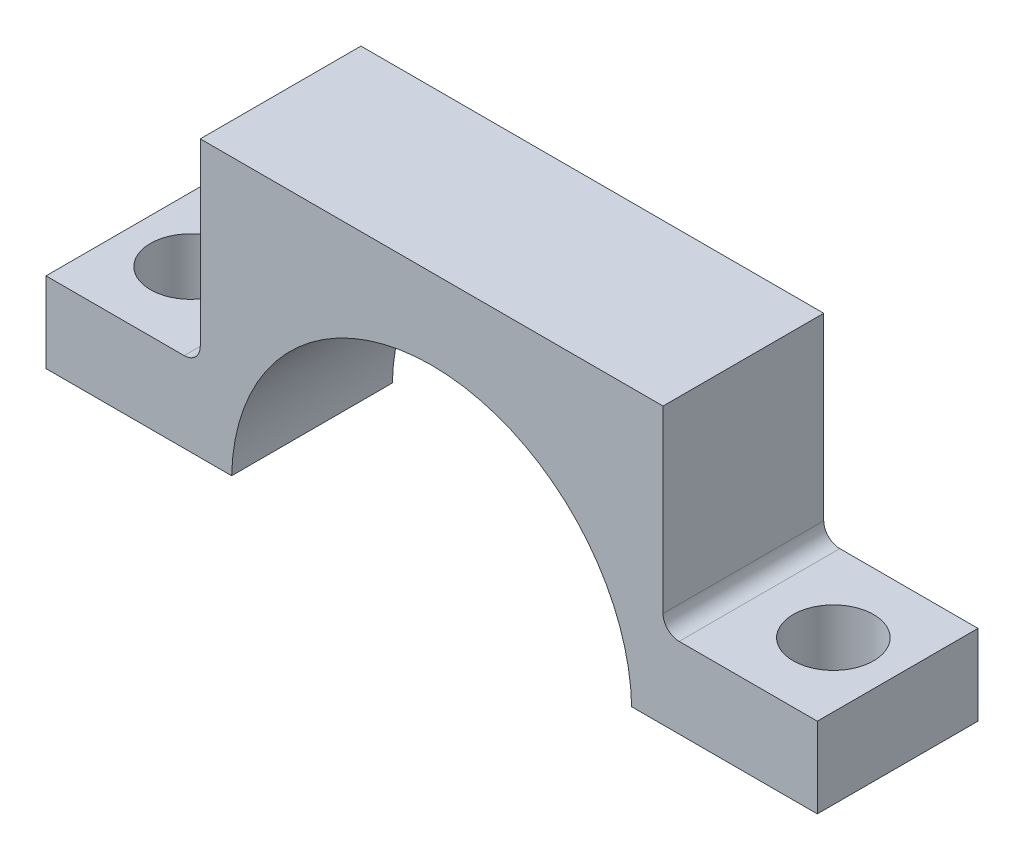
ISO-10303-21;
HEADER;
FILE_DESCRIPTION(('STEP AP214'),'2;1');
FILE_NAME('part.step','',(''),(''),'','','');
FILE_SCHEMA(('AUTOMOTIVE_DESIGN { 1 0 10303 214 1 1 1 1 }'));
ENDSEC;
DATA;
#1=APPLICATION_CONTEXT('core data for automotive mechanical design processes');
#2=APPLICATION_PROTOCOL_DEFINITION('international standard','automotive_design',2000,#1);
#3=PRODUCT_CONTEXT('',#1,'mechanical');
#4=PRODUCT('Part','Part','',(#3));
#5=PRODUCT_RELATED_PRODUCT_CATEGORY('part','',(#4));
#6=PRODUCT_DEFINITION_FORMATION('','',#4);
#7=PRODUCT_DEFINITION_CONTEXT('part definition',#1,'design');
#8=PRODUCT_DEFINITION('design','',#6,#7);
#9=PRODUCT_DEFINITION_SHAPE('','',#8);
#10=(LENGTH_UNIT() NAMED_UNIT(*) SI_UNIT(.MILLI.,.METRE.));
#11=(NAMED_UNIT(*) PLANE_ANGLE_UNIT() SI_UNIT($,.RADIAN.));
#12=(NAMED_UNIT(*) SI_UNIT($,.STERADIAN.) SOLID_ANGLE_UNIT());
#13=UNCERTAINTY_MEASURE_WITH_UNIT(LENGTH_MEASURE(1.E-05),#10,'distance_accuracy_value','');
#14=(GEOMETRIC_REPRESENTATION_CONTEXT(3) GLOBAL_UNCERTAINTY_ASSIGNED_CONTEXT((#13)) GLOBAL_UNIT_ASSIGNED_CONTEXT((#10,
#11,#12)) REPRESENTATION_CONTEXT('',''));
#15=CARTESIAN_POINT('',(0.,0.,0.));
#16=DIRECTION('',(0.,0.,1.));
#17=DIRECTION('',(1.,0.,0.));
#18=AXIS2_PLACEMENT_3D('',#15,#16,#17);
#19=CARTESIAN_POINT('',(14.4,0.266033792618824,5.));
#20=DIRECTION('',(-1.,0.,0.));
#21=DIRECTION('',(0.,0.,1.));
#22=AXIS2_PLACEMENT_3D('',#19,#20,#21);
#23=PLANE('',#22);
#24=DIRECTION('',(0.,1.,0.));
#25=VECTOR('',#24,1.);
#26=CARTESIAN_POINT('',(14.4,0.266033792618824,5.));
#27=LINE('',#26,#25);
#28=CARTESIAN_POINT('',(14.4,6.26603379261882,5.));
#29=VERTEX_POINT('',#28);
#30=CARTESIAN_POINT('',(14.4,17.45,5.));
#31=VERTEX_POINT('',#30);
#32=EDGE_CURVE('E196',#29,#31,#27,.T.);
#33=ORIENTED_EDGE('',*,*,#32,.F.);
#34=DIRECTION('',(0.,0.,-1.));
#35=VECTOR('',#34,1.);
#36=CARTESIAN_POINT('',(14.4,6.26603379261882,5.));
#37=LINE('',#36,#35);
#38=CARTESIAN_POINT('',(14.4,6.26603379261882,-5.));
#39=VERTEX_POINT('',#38);
#40=EDGE_CURVE('E247',#29,#39,#37,.T.);
#41=ORIENTED_EDGE('',*,*,#40,.T.);
#42=DIRECTION('',(0.,1.,0.));
#43=VECTOR('',#42,1.);
#44=CARTESIAN_POINT('',(14.4,0.266033792618824,-5.));
#45=LINE('',#44,#43);
#46=CARTESIAN_POINT('',(14.4,17.45,-5.));
#47=VERTEX_POINT('',#46);
#48=EDGE_CURVE('E192',#39,#47,#45,.T.);
#49=ORIENTED_EDGE('',*,*,#48,.T.);
#50=DIRECTION('',(0.,0.,-1.));
#51=VECTOR('',#50,1.);
#52=CARTESIAN_POINT('',(14.4,17.45,5.));
#53=LINE('',#52,#51);
#54=EDGE_CURVE('E243',#31,#47,#53,.T.);
#55=ORIENTED_EDGE('',*,*,#54,.F.);
#56=EDGE_LOOP('',(#33,#41,#49,#55));
#57=FACE_BOUND('',#56,.T.);
#58=ADVANCED_FACE('F39',(#57),#23,.F.);
#59=CARTESIAN_POINT('',(14.4,17.45,5.));
#60=DIRECTION('',(0.,-1.,0.));
#61=DIRECTION('',(1.,0.,0.));
#62=AXIS2_PLACEMENT_3D('',#59,#60,#61);
#63=PLANE('',#62);
#64=DIRECTION('',(-1.,0.,0.));
#65=VECTOR('',#64,1.);
#66=CARTESIAN_POINT('',(14.4,17.45,-5.));
#67=LINE('',#66,#65);
#68=CARTESIAN_POINT('',(-14.4,17.45,-5.));
#69=VERTEX_POINT('',#68);
#70=EDGE_CURVE('E218',#47,#69,#67,.T.);
#71=ORIENTED_EDGE('',*,*,#70,.T.);
#72=DIRECTION('',(0.,0.,-1.));
#73=VECTOR('',#72,1.);
#74=CARTESIAN_POINT('',(-14.4,17.45,5.));
#75=LINE('',#74,#73);
#76=CARTESIAN_POINT('',(-14.4,17.45,5.));
#77=VERTEX_POINT('',#76);
#78=EDGE_CURVE('E239',#77,#69,#75,.T.);
#79=ORIENTED_EDGE('',*,*,#78,.F.);
#80=DIRECTION('',(-1.,0.,0.));
#81=VECTOR('',#80,1.);
#82=CARTESIAN_POINT('',(14.4,17.45,5.));
#83=LINE('',#82,#81);
#84=EDGE_CURVE('E199',#31,#77,#83,.T.);
#85=ORIENTED_EDGE('',*,*,#84,.F.);
#86=ORIENTED_EDGE('',*,*,#54,.T.);
#87=EDGE_LOOP('',(#71,#79,#85,#86));
#88=FACE_BOUND('',#87,.T.);
#89=ADVANCED_FACE('F307',(#88),#63,.F.);
#90=CARTESIAN_POINT('',(-14.4,0.266033792618821,5.));
#91=DIRECTION('',(1.,0.,0.));
#92=DIRECTION('',(0.,1.,0.));
#93=AXIS2_PLACEMENT_3D('',#90,#91,#92);
#94=PLANE('',#93);
#95=DIRECTION('',(0.,-1.,0.));
#96=VECTOR('',#95,1.);
#97=CARTESIAN_POINT('',(-14.4,0.266033792618821,-5.));
#98=LINE('',#97,#96);
#99=CARTESIAN_POINT('',(-14.4,6.26603379261882,-5.));
#100=VERTEX_POINT('',#99);
#101=EDGE_CURVE('E221',#69,#100,#98,.T.);
#102=ORIENTED_EDGE('',*,*,#101,.T.);
#103=DIRECTION('',(0.,0.,1.));
#104=VECTOR('',#103,1.);
#105=CARTESIAN_POINT('',(-14.4,6.26603379261882,5.));
#106=LINE('',#105,#104);
#107=CARTESIAN_POINT('',(-14.4,6.26603379261882,5.));
#108=VERTEX_POINT('',#107);
#109=EDGE_CURVE('E254',#100,#108,#106,.T.);
#110=ORIENTED_EDGE('',*,*,#109,.T.);
#111=DIRECTION('',(0.,-1.,0.));
#112=VECTOR('',#111,1.);
#113=CARTESIAN_POINT('',(-14.4,0.266033792618821,5.));
#114=LINE('',#113,#112);
#115=EDGE_CURVE('E203',#77,#108,#114,.T.);
#116=ORIENTED_EDGE('',*,*,#115,.F.);
#117=ORIENTED_EDGE('',*,*,#78,.T.);
#118=EDGE_LOOP('',(#102,#110,#116,#117));
#119=FACE_BOUND('',#118,.T.);
#120=ADVANCED_FACE('F303',(#119),#94,.F.);
#121=CARTESIAN_POINT('',(-14.4,0.266033792618821,5.));
#122=DIRECTION('',(0.,1.,0.));
#123=DIRECTION('',(0.,0.,1.));
#124=AXIS2_PLACEMENT_3D('',#121,#122,#123);
#125=PLANE('',#124);
#126=DIRECTION('',(1.,0.,0.));
#127=VECTOR('',#126,1.);
#128=CARTESIAN_POINT('',(-14.4,0.266033792618821,-5.));
#129=LINE('',#128,#127);
#130=CARTESIAN_POINT('',(-24.,0.266033792618821,-5.));
#131=VERTEX_POINT('',#130);
#132=CARTESIAN_POINT('',(-12.4471573470084,0.266033792618822,-5.));
#133=VERTEX_POINT('',#132);
#134=EDGE_CURVE('E133',#131,#133,#129,.T.);
#135=ORIENTED_EDGE('',*,*,#134,.T.);
#136=DIRECTION('',(0.,0.,-1.));
#137=VECTOR('',#136,1.);
#138=CARTESIAN_POINT('',(-12.4471573470084,0.266033792618822,5.));
#139=LINE('',#138,#137);
#140=CARTESIAN_POINT('',(-12.4471573470084,0.266033792618822,5.));
#141=VERTEX_POINT('',#140);
#142=EDGE_CURVE('E235',#141,#133,#139,.T.);
#143=ORIENTED_EDGE('',*,*,#142,.F.);
#144=DIRECTION('',(1.,0.,0.));
#145=VECTOR('',#144,1.);
#146=CARTESIAN_POINT('',(-14.4,0.266033792618821,5.));
#147=LINE('',#146,#145);
#148=CARTESIAN_POINT('',(-24.,0.266033792618821,5.));
#149=VERTEX_POINT('',#148);
#150=EDGE_CURVE('E206',#149,#141,#147,.T.);
#151=ORIENTED_EDGE('',*,*,#150,.F.);
#152=DIRECTION('',(0.,0.,-1.));
#153=VECTOR('',#152,1.);
#154=CARTESIAN_POINT('',(-24.,0.266033792618821,5.));
#155=LINE('',#154,#153);
#156=EDGE_CURVE('E151',#149,#131,#155,.T.);
#157=ORIENTED_EDGE('',*,*,#156,.T.);
#158=EDGE_LOOP('',(#135,#143,#151,#157));
#159=FACE_BOUND('',#158,.T.);
#160=CARTESIAN_POINT('',(-20.,0.266033792618821,0.));
#161=DIRECTION('',(0.,-1.,0.));
#162=DIRECTION('',(0.,0.,-1.));
#163=AXIS2_PLACEMENT_3D('',#160,#161,#162);
#164=CIRCLE('',#163,2.5);
#165=CARTESIAN_POINT('',(-20.,0.266033792618821,-2.5));
#166=VERTEX_POINT('',#165);
#167=EDGE_CURVE('E157',#166,#166,#164,.T.);
#168=ORIENTED_EDGE('',*,*,#167,.F.);
#169=EDGE_LOOP('',(#168));
#170=FACE_BOUND('',#169,.T.);
#171=ADVANCED_FACE('F297',(#159,#170),#125,.F.);
#172=CARTESIAN_POINT('',(0.,0.,5.));
#173=DIRECTION('',(0.,0.,-1.));
#174=DIRECTION('',(-1.,0.,0.));
#175=AXIS2_PLACEMENT_3D('',#172,#173,#174);
#176=CYLINDRICAL_SURFACE('',#175,12.45);
#177=CARTESIAN_POINT('',(0.,0.,-5.));
#178=DIRECTION('',(0.,0.,-1.));
#179=DIRECTION('',(1.,0.,0.));
#180=AXIS2_PLACEMENT_3D('',#177,#178,#179);
#181=CIRCLE('',#180,12.45);
#182=CARTESIAN_POINT('',(12.4471573470084,0.266033792618824,-5.));
#183=VERTEX_POINT('',#182);
#184=EDGE_CURVE('E227',#133,#183,#181,.T.);
#185=ORIENTED_EDGE('',*,*,#184,.T.);
#186=DIRECTION('',(0.,0.,-1.));
#187=VECTOR('',#186,1.);
#188=CARTESIAN_POINT('',(12.4471573470084,0.266033792618824,5.));
#189=LINE('',#188,#187);
#190=CARTESIAN_POINT('',(12.4471573470084,0.266033792618824,5.));
#191=VERTEX_POINT('',#190);
#192=EDGE_CURVE('E215',#191,#183,#189,.T.);
#193=ORIENTED_EDGE('',*,*,#192,.F.);
#194=CARTESIAN_POINT('',(0.,0.,5.));
#195=DIRECTION('',(0.,0.,-1.));
#196=DIRECTION('',(1.,0.,0.));
#197=AXIS2_PLACEMENT_3D('',#194,#195,#196);
#198=CIRCLE('',#197,12.45);
#199=EDGE_CURVE('E209',#141,#191,#198,.T.);
#200=ORIENTED_EDGE('',*,*,#199,.F.);
#201=ORIENTED_EDGE('',*,*,#142,.T.);
#202=EDGE_LOOP('',(#185,#193,#200,#201));
#203=FACE_BOUND('',#202,.T.);
#204=ADVANCED_FACE('F294',(#203),#176,.F.);
#205=CARTESIAN_POINT('',(12.4471573470084,0.266033792618824,5.));
#206=DIRECTION('',(0.,1.,0.));
#207=DIRECTION('',(-1.,0.,0.));
#208=AXIS2_PLACEMENT_3D('',#205,#206,#207);
#209=PLANE('',#208);
#210=DIRECTION('',(1.,0.,0.));
#211=VECTOR('',#210,1.);
#212=CARTESIAN_POINT('',(12.4471573470084,0.266033792618824,-5.));
#213=LINE('',#212,#211);
#214=CARTESIAN_POINT('',(24.,0.266033792618821,-5.));
#215=VERTEX_POINT('',#214);
#216=EDGE_CURVE('E200',#183,#215,#213,.T.);
#217=ORIENTED_EDGE('',*,*,#216,.T.);
#218=DIRECTION('',(0.,0.,1.));
#219=VECTOR('',#218,1.);
#220=CARTESIAN_POINT('',(24.,0.266033792618821,5.));
#221=LINE('',#220,#219);
#222=CARTESIAN_POINT('',(24.,0.266033792618821,5.));
#223=VERTEX_POINT('',#222);
#224=EDGE_CURVE('E169',#215,#223,#221,.T.);
#225=ORIENTED_EDGE('',*,*,#224,.T.);
#226=DIRECTION('',(1.,0.,0.));
#227=VECTOR('',#226,1.);
#228=CARTESIAN_POINT('',(12.4471573470084,0.266033792618824,5.));
#229=LINE('',#228,#227);
#230=EDGE_CURVE('E212',#191,#223,#229,.T.);
#231=ORIENTED_EDGE('',*,*,#230,.F.);
#232=ORIENTED_EDGE('',*,*,#192,.T.);
#233=EDGE_LOOP('',(#217,#225,#231,#232));
#234=FACE_BOUND('',#233,.T.);
#235=CARTESIAN_POINT('',(20.,0.266033792618821,0.));
#236=DIRECTION('',(0.,-1.,0.));
#237=DIRECTION('',(0.,0.,1.));
#238=AXIS2_PLACEMENT_3D('',#235,#236,#237);
#239=CIRCLE('',#238,2.5);
#240=CARTESIAN_POINT('',(20.,0.266033792618821,2.5));
#241=VERTEX_POINT('',#240);
#242=EDGE_CURVE('E163',#241,#241,#239,.T.);
#243=ORIENTED_EDGE('',*,*,#242,.F.);
#244=EDGE_LOOP('',(#243));
#245=FACE_BOUND('',#244,.T.);
#246=ADVANCED_FACE('F288',(#234,#245),#209,.F.);
#247=CARTESIAN_POINT('',(0.,0.,5.));
#248=DIRECTION('',(0.,0.,1.));
#249=DIRECTION('',(1.,0.,0.));
#250=AXIS2_PLACEMENT_3D('',#247,#248,#249);
#251=PLANE('',#250);
#252=ORIENTED_EDGE('',*,*,#230,.T.);
#253=DIRECTION('',(0.,-1.,0.));
#254=VECTOR('',#253,1.);
#255=CARTESIAN_POINT('',(24.,5.26603379261882,5.));
#256=LINE('',#255,#254);
#257=CARTESIAN_POINT('',(24.,5.26603379261882,5.));
#258=VERTEX_POINT('',#257);
#259=EDGE_CURVE('E188',#258,#223,#256,.T.);
#260=ORIENTED_EDGE('',*,*,#259,.F.);
#261=DIRECTION('',(-1.,0.,0.));
#262=VECTOR('',#261,1.);
#263=CARTESIAN_POINT('',(14.4,5.26603379261882,5.));
#264=LINE('',#263,#262);
#265=CARTESIAN_POINT('',(15.4,5.26603379261882,5.));
#266=VERTEX_POINT('',#265);
#267=EDGE_CURVE('E180',#258,#266,#264,.T.);
#268=ORIENTED_EDGE('',*,*,#267,.T.);
#269=CARTESIAN_POINT('',(15.4,6.26603379261882,5.));
#270=DIRECTION('',(0.,0.,1.));
#271=DIRECTION('',(1.,0.,0.));
#272=AXIS2_PLACEMENT_3D('',#269,#270,#271);
#273=CIRCLE('',#272,1.);
#274=EDGE_CURVE('E263',#266,#29,#273,.F.);
#275=ORIENTED_EDGE('',*,*,#274,.T.);
#276=ORIENTED_EDGE('',*,*,#32,.T.);
#277=ORIENTED_EDGE('',*,*,#84,.T.);
#278=ORIENTED_EDGE('',*,*,#115,.T.);
#279=CARTESIAN_POINT('',(-15.4,6.26603379261882,5.));
#280=DIRECTION('',(0.,0.,1.));
#281=DIRECTION('',(1.,0.,0.));
#282=AXIS2_PLACEMENT_3D('',#279,#280,#281);
#283=CIRCLE('',#282,1.);
#284=CARTESIAN_POINT('',(-15.4,5.26603379261882,5.));
#285=VERTEX_POINT('',#284);
#286=EDGE_CURVE('E48',#108,#285,#283,.F.);
#287=ORIENTED_EDGE('',*,*,#286,.T.);
#288=DIRECTION('',(-1.,0.,0.));
#289=VECTOR('',#288,1.);
#290=CARTESIAN_POINT('',(-24.,5.26603379261882,5.));
#291=LINE('',#290,#289);
#292=CARTESIAN_POINT('',(-24.,5.26603379261882,5.));
#293=VERTEX_POINT('',#292);
#294=EDGE_CURVE('E140',#285,#293,#291,.T.);
#295=ORIENTED_EDGE('',*,*,#294,.T.);
#296=DIRECTION('',(0.,-1.,0.));
#297=VECTOR('',#296,1.);
#298=CARTESIAN_POINT('',(-24.,5.26603379261882,5.));
#299=LINE('',#298,#297);
#300=EDGE_CURVE('E139',#293,#149,#299,.T.);
#301=ORIENTED_EDGE('',*,*,#300,.T.);
#302=ORIENTED_EDGE('',*,*,#150,.T.);
#303=ORIENTED_EDGE('',*,*,#199,.T.);
#304=EDGE_LOOP('',(#252,#260,#268,#275,#276,#277,#278,#287,#295,#301,#302,#303));
#305=FACE_BOUND('',#304,.T.);
#306=ADVANCED_FACE('F268',(#305),#251,.T.);
#307=CARTESIAN_POINT('',(0.,0.,-5.));
#308=DIRECTION('',(0.,0.,1.));
#309=DIRECTION('',(1.,0.,0.));
#310=AXIS2_PLACEMENT_3D('',#307,#308,#309);
#311=PLANE('',#310);
#312=ORIENTED_EDGE('',*,*,#48,.F.);
#313=CARTESIAN_POINT('',(15.4,6.26603379261882,-5.));
#314=DIRECTION('',(0.,0.,1.));
#315=DIRECTION('',(1.,0.,0.));
#316=AXIS2_PLACEMENT_3D('',#313,#314,#315);
#317=CIRCLE('',#316,1.);
#318=CARTESIAN_POINT('',(15.4,5.26603379261882,-5.));
#319=VERTEX_POINT('',#318);
#320=EDGE_CURVE('E260',#39,#319,#317,.T.);
#321=ORIENTED_EDGE('',*,*,#320,.T.);
#322=DIRECTION('',(1.,0.,0.));
#323=VECTOR('',#322,1.);
#324=CARTESIAN_POINT('',(14.4,5.26603379261882,-5.));
#325=LINE('',#324,#323);
#326=CARTESIAN_POINT('',(24.,5.26603379261882,-5.));
#327=VERTEX_POINT('',#326);
#328=EDGE_CURVE('E173',#319,#327,#325,.T.);
#329=ORIENTED_EDGE('',*,*,#328,.T.);
#330=DIRECTION('',(0.,-1.,0.));
#331=VECTOR('',#330,1.);
#332=CARTESIAN_POINT('',(24.,5.26603379261882,-5.));
#333=LINE('',#332,#331);
#334=EDGE_CURVE('E184',#327,#215,#333,.T.);
#335=ORIENTED_EDGE('',*,*,#334,.T.);
#336=ORIENTED_EDGE('',*,*,#216,.F.);
#337=ORIENTED_EDGE('',*,*,#184,.F.);
#338=ORIENTED_EDGE('',*,*,#134,.F.);
#339=DIRECTION('',(0.,-1.,0.));
#340=VECTOR('',#339,1.);
#341=CARTESIAN_POINT('',(-24.,5.26603379261882,-5.));
#342=LINE('',#341,#340);
#343=CARTESIAN_POINT('',(-24.,5.26603379261882,-5.));
#344=VERTEX_POINT('',#343);
#345=EDGE_CURVE('E127',#344,#131,#342,.T.);
#346=ORIENTED_EDGE('',*,*,#345,.F.);
#347=DIRECTION('',(1.,0.,0.));
#348=VECTOR('',#347,1.);
#349=CARTESIAN_POINT('',(-24.,5.26603379261882,-5.));
#350=LINE('',#349,#348);
#351=CARTESIAN_POINT('',(-15.4,5.26603379261882,-5.));
#352=VERTEX_POINT('',#351);
#353=EDGE_CURVE('E130',#344,#352,#350,.T.);
#354=ORIENTED_EDGE('',*,*,#353,.T.);
#355=CARTESIAN_POINT('',(-15.4,6.26603379261882,-5.));
#356=DIRECTION('',(0.,0.,1.));
#357=DIRECTION('',(1.,0.,0.));
#358=AXIS2_PLACEMENT_3D('',#355,#356,#357);
#359=CIRCLE('',#358,1.);
#360=EDGE_CURVE('E11',#352,#100,#359,.T.);
#361=ORIENTED_EDGE('',*,*,#360,.T.);
#362=ORIENTED_EDGE('',*,*,#101,.F.);
#363=ORIENTED_EDGE('',*,*,#70,.F.);
#364=EDGE_LOOP('',(#312,#321,#329,#335,#336,#337,#338,#346,#354,#361,#362,#363));
#365=FACE_BOUND('',#364,.T.);
#366=ADVANCED_FACE('F129',(#365),#311,.F.);
#367=CARTESIAN_POINT('',(24.,5.26603379261882,5.));
#368=DIRECTION('',(1.,0.,0.));
#369=DIRECTION('',(0.,0.,-1.));
#370=AXIS2_PLACEMENT_3D('',#367,#368,#369);
#371=PLANE('',#370);
#372=ORIENTED_EDGE('',*,*,#224,.F.);
#373=ORIENTED_EDGE('',*,*,#334,.F.);
#374=DIRECTION('',(0.,0.,1.));
#375=VECTOR('',#374,1.);
#376=CARTESIAN_POINT('',(24.,5.26603379261882,5.));
#377=LINE('',#376,#375);
#378=EDGE_CURVE('E176',#327,#258,#377,.T.);
#379=ORIENTED_EDGE('',*,*,#378,.T.);
#380=ORIENTED_EDGE('',*,*,#259,.T.);
#381=EDGE_LOOP('',(#372,#373,#379,#380));
#382=FACE_BOUND('',#381,.T.);
#383=ADVANCED_FACE('F285',(#382),#371,.T.);
#384=CARTESIAN_POINT('',(0.,5.26603379261882,0.));
#385=DIRECTION('',(0.,1.,0.));
#386=DIRECTION('',(0.,0.,1.));
#387=AXIS2_PLACEMENT_3D('',#384,#385,#386);
#388=PLANE('',#387);
#389=CARTESIAN_POINT('',(20.,5.26603379261882,0.));
#390=DIRECTION('',(0.,-1.,0.));
#391=DIRECTION('',(0.,0.,1.));
#392=AXIS2_PLACEMENT_3D('',#389,#390,#391);
#393=CIRCLE('',#392,2.5);
#394=CARTESIAN_POINT('',(20.,5.26603379261882,2.5));
#395=VERTEX_POINT('',#394);
#396=EDGE_CURVE('E165',#395,#395,#393,.T.);
#397=ORIENTED_EDGE('',*,*,#396,.T.);
#398=EDGE_LOOP('',(#397));
#399=FACE_BOUND('',#398,.T.);
#400=ORIENTED_EDGE('',*,*,#328,.F.);
#401=DIRECTION('',(0.,0.,-1.));
#402=VECTOR('',#401,1.);
#403=CARTESIAN_POINT('',(15.4,5.26603379261882,0.));
#404=LINE('',#403,#402);
#405=EDGE_CURVE('E251',#319,#266,#404,.F.);
#406=ORIENTED_EDGE('',*,*,#405,.T.);
#407=ORIENTED_EDGE('',*,*,#267,.F.);
#408=ORIENTED_EDGE('',*,*,#378,.F.);
#409=EDGE_LOOP('',(#400,#406,#407,#408));
#410=FACE_BOUND('',#409,.T.);
#411=ADVANCED_FACE('F282',(#399,#410),#388,.T.);
#412=CARTESIAN_POINT('',(20.,5.26603379261882,0.));
#413=DIRECTION('',(0.,-1.,0.));
#414=DIRECTION('',(0.,0.,-1.));
#415=AXIS2_PLACEMENT_3D('',#412,#413,#414);
#416=CYLINDRICAL_SURFACE('',#415,2.5);
#417=ORIENTED_EDGE('',*,*,#396,.F.);
#418=EDGE_LOOP('',(#417));
#419=FACE_BOUND('',#418,.T.);
#420=ORIENTED_EDGE('',*,*,#242,.T.);
#421=EDGE_LOOP('',(#420));
#422=FACE_BOUND('',#421,.T.);
#423=ADVANCED_FACE('F335',(#419,#422),#416,.F.);
#424=CARTESIAN_POINT('',(-24.,5.26603379261882,5.));
#425=DIRECTION('',(-1.,0.,0.));
#426=DIRECTION('',(0.,0.,1.));
#427=AXIS2_PLACEMENT_3D('',#424,#425,#426);
#428=PLANE('',#427);
#429=ORIENTED_EDGE('',*,*,#156,.F.);
#430=ORIENTED_EDGE('',*,*,#300,.F.);
#431=DIRECTION('',(0.,0.,-1.));
#432=VECTOR('',#431,1.);
#433=CARTESIAN_POINT('',(-24.,5.26603379261882,5.));
#434=LINE('',#433,#432);
#435=EDGE_CURVE('E144',#293,#344,#434,.T.);
#436=ORIENTED_EDGE('',*,*,#435,.T.);
#437=ORIENTED_EDGE('',*,*,#345,.T.);
#438=EDGE_LOOP('',(#429,#430,#436,#437));
#439=FACE_BOUND('',#438,.T.);
#440=ADVANCED_FACE('F148',(#439),#428,.T.);
#441=CARTESIAN_POINT('',(0.,5.26603379261882,0.));
#442=DIRECTION('',(0.,-1.,0.));
#443=DIRECTION('',(0.,0.,-1.));
#444=AXIS2_PLACEMENT_3D('',#441,#442,#443);
#445=PLANE('',#444);
#446=CARTESIAN_POINT('',(-20.,5.26603379261882,0.));
#447=DIRECTION('',(0.,-1.,0.));
#448=DIRECTION('',(0.,0.,-1.));
#449=AXIS2_PLACEMENT_3D('',#446,#447,#448);
#450=CIRCLE('',#449,2.5);
#451=CARTESIAN_POINT('',(-20.,5.26603379261882,-2.5));
#452=VERTEX_POINT('',#451);
#453=EDGE_CURVE('E154',#452,#452,#450,.T.);
#454=ORIENTED_EDGE('',*,*,#453,.T.);
#455=EDGE_LOOP('',(#454));
#456=FACE_BOUND('',#455,.T.);
#457=ORIENTED_EDGE('',*,*,#294,.F.);
#458=DIRECTION('',(0.,0.,1.));
#459=VECTOR('',#458,1.);
#460=CARTESIAN_POINT('',(-15.4,5.26603379261882,-5.));
#461=LINE('',#460,#459);
#462=EDGE_CURVE('E55',#285,#352,#461,.F.);
#463=ORIENTED_EDGE('',*,*,#462,.T.);
#464=ORIENTED_EDGE('',*,*,#353,.F.);
#465=ORIENTED_EDGE('',*,*,#435,.F.);
#466=EDGE_LOOP('',(#457,#463,#464,#465));
#467=FACE_BOUND('',#466,.T.);
#468=ADVANCED_FACE('F143',(#456,#467),#445,.F.);
#469=CARTESIAN_POINT('',(-20.,5.26603379261882,0.));
#470=DIRECTION('',(0.,-1.,0.));
#471=DIRECTION('',(0.,0.,-1.));
#472=AXIS2_PLACEMENT_3D('',#469,#470,#471);
#473=CYLINDRICAL_SURFACE('',#472,2.5);
#474=ORIENTED_EDGE('',*,*,#453,.F.);
#475=EDGE_LOOP('',(#474));
#476=FACE_BOUND('',#475,.T.);
#477=ORIENTED_EDGE('',*,*,#167,.T.);
#478=EDGE_LOOP('',(#477));
#479=FACE_BOUND('',#478,.T.);
#480=ADVANCED_FACE('F318',(#476,#479),#473,.F.);
#481=CARTESIAN_POINT('',(15.4,6.26603379261882,5.));
#482=DIRECTION('',(0.,0.,-1.));
#483=DIRECTION('',(-1.,0.,0.));
#484=AXIS2_PLACEMENT_3D('',#481,#482,#483);
#485=CYLINDRICAL_SURFACE('',#484,1.);
#486=ORIENTED_EDGE('',*,*,#274,.F.);
#487=ORIENTED_EDGE('',*,*,#405,.F.);
#488=ORIENTED_EDGE('',*,*,#320,.F.);
#489=ORIENTED_EDGE('',*,*,#40,.F.);
#490=EDGE_LOOP('',(#486,#487,#488,#489));
#491=FACE_BOUND('',#490,.T.);
#492=ADVANCED_FACE('F276',(#491),#485,.F.);
#493=CARTESIAN_POINT('',(-15.4,6.26603379261882,5.));
#494=DIRECTION('',(0.,0.,-1.));
#495=DIRECTION('',(-1.,0.,0.));
#496=AXIS2_PLACEMENT_3D('',#493,#494,#495);
#497=CYLINDRICAL_SURFACE('',#496,1.);
#498=ORIENTED_EDGE('',*,*,#360,.F.);
#499=ORIENTED_EDGE('',*,*,#462,.F.);
#500=ORIENTED_EDGE('',*,*,#286,.F.);
#501=ORIENTED_EDGE('',*,*,#109,.F.);
#502=EDGE_LOOP('',(#498,#499,#500,#501));
#503=FACE_BOUND('',#502,.T.);
#504=ADVANCED_FACE('F41',(#503),#497,.F.);
#505=CLOSED_SHELL('',(#58,#89,#120,#171,#204,#246,#306,#366,#383,#411,#423,#440,#468,#480,#492,#504));
#506=MANIFOLD_SOLID_BREP('B2',#505);
#507=ADVANCED_BREP_SHAPE_REPRESENTATION('',(#18,#506),#14);
#508=SHAPE_DEFINITION_REPRESENTATION(#9,#507);
ENDSEC;
END-ISO-10303-21;
